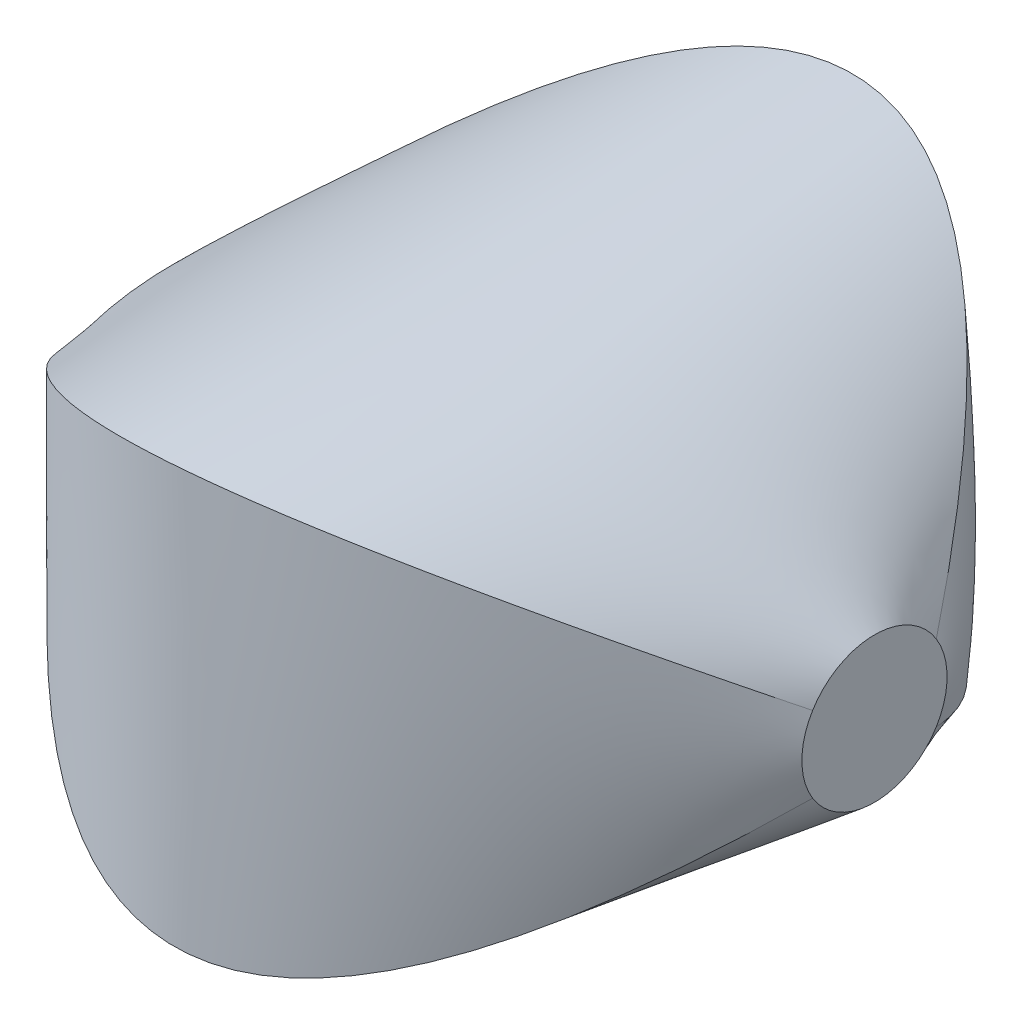
ISO-10303-21;
HEADER;
FILE_DESCRIPTION(('STEP AP214'),'2;1');
FILE_NAME('part.step','',(''),(''),'','','');
FILE_SCHEMA(('AUTOMOTIVE_DESIGN { 1 0 10303 214 1 1 1 1 }'));
ENDSEC;
DATA;
#1=APPLICATION_CONTEXT('core data for automotive mechanical design processes');
#2=APPLICATION_PROTOCOL_DEFINITION('international standard','automotive_design',2000,#1);
#3=PRODUCT_CONTEXT('',#1,'mechanical');
#4=PRODUCT('Part','Part','',(#3));
#5=PRODUCT_RELATED_PRODUCT_CATEGORY('part','',(#4));
#6=PRODUCT_DEFINITION_FORMATION('','',#4);
#7=PRODUCT_DEFINITION_CONTEXT('part definition',#1,'design');
#8=PRODUCT_DEFINITION('design','',#6,#7);
#9=PRODUCT_DEFINITION_SHAPE('','',#8);
#10=(LENGTH_UNIT() NAMED_UNIT(*) SI_UNIT(.MILLI.,.METRE.));
#11=(NAMED_UNIT(*) PLANE_ANGLE_UNIT() SI_UNIT($,.RADIAN.));
#12=(NAMED_UNIT(*) SI_UNIT($,.STERADIAN.) SOLID_ANGLE_UNIT());
#13=UNCERTAINTY_MEASURE_WITH_UNIT(LENGTH_MEASURE(1.E-05),#10,'distance_accuracy_value','');
#14=(GEOMETRIC_REPRESENTATION_CONTEXT(3) GLOBAL_UNCERTAINTY_ASSIGNED_CONTEXT((#13)) GLOBAL_UNIT_ASSIGNED_CONTEXT((#10,
#11,#12)) REPRESENTATION_CONTEXT('',''));
#15=CARTESIAN_POINT('',(0.,0.,0.));
#16=DIRECTION('',(0.,0.,1.));
#17=DIRECTION('',(1.,0.,0.));
#18=AXIS2_PLACEMENT_3D('',#15,#16,#17);
#19=CARTESIAN_POINT('',(50.,0.,0.));
#20=DIRECTION('',(1.,0.,0.));
#21=DIRECTION('',(0.,0.,-1.));
#22=AXIS2_PLACEMENT_3D('',#19,#20,#21);
#23=PLANE('',#22);
#24=CARTESIAN_POINT('',(50.,0.,0.));
#25=DIRECTION('',(1.,0.,0.));
#26=DIRECTION('',(0.,0.,-1.));
#27=AXIS2_PLACEMENT_3D('',#24,#25,#26);
#28=CIRCLE('',#27,10.);
#29=CARTESIAN_POINT('',(50.,5.23707774198885,-8.51897979363521));
#30=VERTEX_POINT('',#29);
#31=CARTESIAN_POINT('',(50.,5.23707774198886,8.5189797936352));
#32=VERTEX_POINT('',#31);
#33=EDGE_CURVE('E12',#30,#32,#28,.T.);
#34=ORIENTED_EDGE('',*,*,#33,.T.);
#35=CARTESIAN_POINT('',(50.,-5.23707774198886,8.5189797936352));
#36=VERTEX_POINT('',#35);
#37=EDGE_CURVE('E136',#32,#36,#28,.T.);
#38=ORIENTED_EDGE('',*,*,#37,.T.);
#39=CARTESIAN_POINT('',(50.,-5.23707774198886,-8.5189797936352));
#40=VERTEX_POINT('',#39);
#41=EDGE_CURVE('E280',#36,#40,#28,.T.);
#42=ORIENTED_EDGE('',*,*,#41,.T.);
#43=EDGE_CURVE('E201',#40,#30,#28,.T.);
#44=ORIENTED_EDGE('',*,*,#43,.T.);
#45=EDGE_LOOP('',(#34,#38,#42,#44));
#46=FACE_BOUND('',#45,.T.);
#47=ADVANCED_FACE('F125',(#46),#23,.T.);
#48=CARTESIAN_POINT('',(-50.,0.,0.));
#49=DIRECTION('',(1.,0.,0.));
#50=DIRECTION('',(0.,0.,-1.));
#51=AXIS2_PLACEMENT_3D('',#48,#49,#50);
#52=PLANE('',#51);
#53=CARTESIAN_POINT('',(-50.,0.,0.));
#54=DIRECTION('',(1.,0.,0.));
#55=DIRECTION('',(0.,0.0792949814580493,-0.996851195472809));
#56=AXIS2_PLACEMENT_3D('',#53,#54,#55);
#57=ELLIPSE('',#56,10.0315875081606,2.36185766200092);
#58=CARTESIAN_POINT('',(-50.,0.385148291112215,-9.88721745718651));
#59=VERTEX_POINT('',#58);
#60=CARTESIAN_POINT('',(-50.,1.07060677175906,-9.90626987124121));
#61=VERTEX_POINT('',#60);
#62=EDGE_CURVE('E169',#59,#61,#57,.T.);
#63=ORIENTED_EDGE('',*,*,#62,.F.);
#64=CARTESIAN_POINT('',(-50.,-1.07060677175906,9.90626987124122));
#65=VERTEX_POINT('',#64);
#66=EDGE_CURVE('E174',#65,#59,#57,.T.);
#67=ORIENTED_EDGE('',*,*,#66,.F.);
#68=CARTESIAN_POINT('',(-50.,-0.385148291112216,9.88721745718651));
#69=VERTEX_POINT('',#68);
#70=EDGE_CURVE('E195',#69,#65,#57,.T.);
#71=ORIENTED_EDGE('',*,*,#70,.F.);
#72=EDGE_CURVE('E176',#61,#69,#57,.T.);
#73=ORIENTED_EDGE('',*,*,#72,.F.);
#74=EDGE_LOOP('',(#63,#67,#71,#73));
#75=FACE_BOUND('',#74,.T.);
#76=ADVANCED_FACE('F172',(#75),#52,.F.);
#77=CARTESIAN_POINT('',(-50.,-0.385148291112216,9.88721745718651));
#78=CARTESIAN_POINT('',(-33.6537867469248,18.0545955535037,34.6593630308246));
#79=CARTESIAN_POINT('',(-0.387090231439185,37.4476209110736,59.2028119403248));
#80=CARTESIAN_POINT('',(33.0128799197419,21.8027462422378,33.747204588457));
#81=CARTESIAN_POINT('',(50.,5.23707774198886,8.5189797936352));
#82=CARTESIAN_POINT('',(-50.,-0.622701145356153,10.0332540479102));
#83=CARTESIAN_POINT('',(-33.6073694324775,5.76301701046526,34.8016006277786));
#84=CARTESIAN_POINT('',(-0.433518003647173,12.4250531851073,58.1256835477101));
#85=CARTESIAN_POINT('',(33.0592972341892,7.62471632565103,35.7198896780428));
#86=CARTESIAN_POINT('',(50.,2.02544051382655,10.4933469420956));
#87=CARTESIAN_POINT('',(-50.,-0.853605851347531,10.0396720764122));
#88=CARTESIAN_POINT('',(-33.5609521180302,-6.52191338432063,34.804219662511));
#89=CARTESIAN_POINT('',(-0.479945775855162,-12.1721444257278,58.1252606070612));
#90=CARTESIAN_POINT('',(33.1057145486365,-7.39255739042648,35.7182076191681));
#91=CARTESIAN_POINT('',(50.,-2.02544051382655,10.4933469420956));
#92=CARTESIAN_POINT('',(-50.,-1.07060677175906,9.90626987124122));
#93=CARTESIAN_POINT('',(-33.5145348035829,-18.7929399935267,34.6670184635703));
#94=CARTESIAN_POINT('',(-0.52637354806315,-37.2047722906626,59.2016418362333));
#95=CARTESIAN_POINT('',(33.1521318630838,-21.5705873070132,33.7421584118329));
#96=CARTESIAN_POINT('',(50.,-5.23707774198886,8.5189797936352));
#97=B_SPLINE_SURFACE_WITH_KNOTS('',3,3,((#77,#78,#79,#80,#81),(#82,#83,#84,#85,#86),(#87,#88,
#89,#90,#91),(#92,#93,#94,#95,#96)),.UNSPECIFIED.,.F.,.F.,.F.,(4,4),(4,1,4),(0.,1.),(0.,
0.505306521044614,1.),.UNSPECIFIED.);
#98=CARTESIAN_POINT('',(-50.,-1.07060677175906,9.90626987124122));
#99=CARTESIAN_POINT('',(-33.5145348035829,-18.7929399935267,34.6670184635703));
#100=CARTESIAN_POINT('',(-0.52637354806315,-37.2047722906626,59.2016418362333));
#101=CARTESIAN_POINT('',(33.1521318630838,-21.5705873070132,33.7421584118329));
#102=CARTESIAN_POINT('',(50.,-5.23707774198886,8.5189797936352));
#103=B_SPLINE_CURVE_WITH_KNOTS('',3,(#98,#99,#100,#101,#102),.UNSPECIFIED.,.F.,.F.,(4,1,4),(0.,
0.505306521044614,1.),.UNSPECIFIED.);
#104=EDGE_CURVE('E193',#65,#36,#103,.T.);
#105=CARTESIAN_POINT('',(-50.,-0.385148291112216,9.88721745718651));
#106=CARTESIAN_POINT('',(-33.6537867469248,18.0545955535037,34.6593630308246));
#107=CARTESIAN_POINT('',(-0.387090231439185,37.4476209110736,59.2028119403248));
#108=CARTESIAN_POINT('',(33.0128799197419,21.8027462422378,33.747204588457));
#109=CARTESIAN_POINT('',(50.,5.23707774198886,8.5189797936352));
#110=B_SPLINE_CURVE_WITH_KNOTS('',3,(#105,#106,#107,#108,#109),.UNSPECIFIED.,.F.,.F.,(4,1,4),
(0.,0.505306521044614,1.),.UNSPECIFIED.);
#111=EDGE_CURVE('E182',#32,#69,#110,.F.);
#112=CARTESIAN_POINT('',(-50.,-0.385148291112216,9.88721745718651));
#113=CARTESIAN_POINT('',(-33.6537867469248,18.0545955535037,34.6593630308246));
#114=CARTESIAN_POINT('',(-0.387090231439185,37.4476209110736,59.2028119403248));
#115=CARTESIAN_POINT('',(33.0128799197419,21.8027462422378,33.747204588457));
#116=CARTESIAN_POINT('',(50.,5.23707774198886,8.5189797936352));
#117=CARTESIAN_POINT('',(50.000034338678,5.23704425525575,8.51892879594498));
#118=CARTESIAN_POINT('',(50.000068677356,5.23701076852264,8.51887779825476));
#119=CARTESIAN_POINT('',(50.000103016034,5.23697728178953,8.51882680056454));
#120=CARTESIAN_POINT('',(-50.,-0.622701145356153,10.0332540479102));
#121=CARTESIAN_POINT('',(-33.6073694324775,5.76301701046526,34.8016006277786));
#122=CARTESIAN_POINT('',(-0.433518003647173,12.4250531851073,58.1256835477101));
#123=CARTESIAN_POINT('',(33.0592972341892,7.62471632565103,35.7198896780428));
#124=CARTESIAN_POINT('',(50.,2.02544051382655,10.4933469420956));
#125=CARTESIAN_POINT('',(50.0000342448475,2.02542919514933,10.4932959478056));
#126=CARTESIAN_POINT('',(50.0000684896951,2.02541787647211,10.4932449535156));
#127=CARTESIAN_POINT('',(50.0001027345426,2.02540655779488,10.4931939592256));
#128=CARTESIAN_POINT('',(-50.,-0.853605851347531,10.0396720764122));
#129=CARTESIAN_POINT('',(-33.5609521180302,-6.52191338432063,34.804219662511));
#130=CARTESIAN_POINT('',(-0.479945775855162,-12.1721444257278,58.1252606070612));
#131=CARTESIAN_POINT('',(33.1057145486365,-7.39255739042648,35.7182076191681));
#132=CARTESIAN_POINT('',(50.,-2.02544051382655,10.4933469420956));
#133=CARTESIAN_POINT('',(50.0000341510171,-2.02542966444788,10.4932959512058));
#134=CARTESIAN_POINT('',(50.0000683020342,-2.02541881506922,10.493244960316));
#135=CARTESIAN_POINT('',(50.0001024530513,-2.02540796569055,10.4931939694262));
#136=CARTESIAN_POINT('',(-50.,-1.07060677175906,9.90626987124122));
#137=CARTESIAN_POINT('',(-33.5145348035829,-18.7929399935267,34.6670184635703));
#138=CARTESIAN_POINT('',(-0.52637354806315,-37.2047722906626,59.2016418362333));
#139=CARTESIAN_POINT('',(33.1521318630838,-21.5705873070132,33.7421584118329));
#140=CARTESIAN_POINT('',(50.,-5.23707774198886,8.5189797936352));
#141=CARTESIAN_POINT('',(50.0000340571866,-5.2370447245543,8.5189288061456));
#142=CARTESIAN_POINT('',(50.0000681143733,-5.23701170711975,8.51887781865598));
#143=CARTESIAN_POINT('',(50.0001021715599,-5.2369786896852,8.51882683116638));
#144=B_SPLINE_SURFACE_WITH_KNOTS('',3,3,((#112,#113,#114,#115,#116,#117,#118,#119),(#120,#121,
#122,#123,#124,#125,#126,#127),(#128,#129,#130,#131,#132,#133,#134,#135),(#136,#137,#138,#139,
#140,#141,#142,#143)),.UNSPECIFIED.,.F.,.F.,.F.,(4,4),(4,1,3,4),(0.,1.),(0.,0.505306521044614,
1.,1.000001),.UNSPECIFIED.);
#145=ORIENTED_EDGE('',*,*,#70,.T.);
#146=ORIENTED_EDGE('',*,*,#104,.T.);
#147=ORIENTED_EDGE('',*,*,#37,.F.);
#148=ORIENTED_EDGE('',*,*,#111,.T.);
#149=EDGE_LOOP('',(#145,#146,#147,#148));
#150=FACE_BOUND('',#149,.T.);
#151=ADVANCED_FACE('F293',(#150),#144,.T.);
#152=CARTESIAN_POINT('',(-50.,-1.07060677175906,9.90626987124122));
#153=CARTESIAN_POINT('',(-33.5145348035829,-18.7929399935267,34.6670184635703));
#154=CARTESIAN_POINT('',(-0.526373548063146,-37.2047722906626,59.2016418362333));
#155=CARTESIAN_POINT('',(33.1521318630838,-21.5705873070132,33.7421584118329));
#156=CARTESIAN_POINT('',(50.,-5.23707774198886,8.5189797936352));
#157=CARTESIAN_POINT('',(-50.,-1.34886627650671,9.73520870028979));
#158=CARTESIAN_POINT('',(-33.5395617236974,-18.8237368500363,32.1348987247623));
#159=CARTESIAN_POINT('',(-0.501340989416021,-37.0131225008222,54.0600631410415));
#160=CARTESIAN_POINT('',(33.1271049429693,-21.9163195995369,30.9958190211114));
#161=CARTESIAN_POINT('',(50.,-5.97690766699647,8.06416631514692));
#162=CARTESIAN_POINT('',(-50.,-1.83597939802293,8.95892922429729));
#163=CARTESIAN_POINT('',(-33.5896155639264,-18.8159246750765,26.6365021130566));
#164=CARTESIAN_POINT('',(-0.45127587212177,-36.7375789703456,44.0782039054848));
#165=CARTESIAN_POINT('',(33.0770511027403,-22.4633195418281,25.3293116641242));
#166=CARTESIAN_POINT('',(50.0000000000001,-7.31210287425547,6.98071078262633));
#167=CARTESIAN_POINT('',(-50.0000000000001,-2.32207109054673,6.71628382131466));
#168=CARTESIAN_POINT('',(-33.735073138054,-18.8053647734551,18.1185781080963));
#169=CARTESIAN_POINT('',(-0.305785526591588,-36.397796524208,29.1898644008506));
#170=CARTESIAN_POINT('',(32.9315935286127,-23.1387323896625,16.9232921398906));
#171=CARTESIAN_POINT('',(50.,-8.82076249913179,4.92800380245923));
#172=CARTESIAN_POINT('',(-49.9999999999999,-2.53403566663348,3.71226737888908));
#173=CARTESIAN_POINT('',(-33.8512363849517,-18.7380487393597,9.21266208092382));
#174=CARTESIAN_POINT('',(-0.189596108265163,-36.2131508420589,14.5209516848234));
#175=CARTESIAN_POINT('',(32.815430281715,-23.5647854905728,8.45950140617163));
#176=CARTESIAN_POINT('',(50.,-9.77454968025243,2.58136340122052));
#177=CARTESIAN_POINT('',(-50.,-2.42789647170414,0.0675680554316146));
#178=CARTESIAN_POINT('',(-33.9156461210027,-18.6220125841813,0.0342800910010694));
#179=CARTESIAN_POINT('',(-0.125171860784285,-36.1776978057717,-0.0112809353406747));
#180=CARTESIAN_POINT('',(32.751020545664,-23.745415397275,-0.0107672317586047));
#181=CARTESIAN_POINT('',(50.,-10.1127251598738,0.));
#182=CARTESIAN_POINT('',(-50.0000000000001,-1.99722943993457,-3.58653412761509));
#183=CARTESIAN_POINT('',(-33.9012184625638,-18.4630846091523,-9.14952575131821));
#184=CARTESIAN_POINT('',(-0.139602769755937,-36.3054994901793,-14.5412959930053));
#185=CARTESIAN_POINT('',(32.765448204103,-23.6475026099747,-8.48017943419427));
#186=CARTESIAN_POINT('',(50.,-9.77454968025241,-2.58136340122053));
#187=CARTESIAN_POINT('',(-49.9999999999999,-1.34166467021577,-6.61402328354616));
#188=CARTESIAN_POINT('',(-33.8272821823393,-18.3029470884248,-18.0684941191971));
#189=CARTESIAN_POINT('',(-0.213555707728246,-36.5661268536422,-29.2051275756776));
#190=CARTESIAN_POINT('',(32.8393844843272,-23.290677257613,-16.9414091774442));
#191=CARTESIAN_POINT('',(49.9999999999999,-8.82076249913181,-4.92800380245921));
#192=CARTESIAN_POINT('',(-50.,-0.522980260919271,-8.89354640524878));
#193=CARTESIAN_POINT('',(-33.7159183684582,-18.1515254545434,-26.6062918578362));
#194=CARTESIAN_POINT('',(-0.324944611732168,-36.9565241681228,-44.0862109779684));
#195=CARTESIAN_POINT('',(32.9507482982086,-22.6714095565139,-25.3425884263954));
#196=CARTESIAN_POINT('',(50.,-7.31210287425547,-6.98071078262634));
#197=CARTESIAN_POINT('',(-50.,0.0805351150577006,-9.69995525879234));
#198=CARTESIAN_POINT('',(-33.6744972874358,-18.0888091792276,-32.1189674587468));
#199=CARTESIAN_POINT('',(-0.366375024870191,-37.2583961664162,-54.0638830585789));
#200=CARTESIAN_POINT('',(32.9921693792308,-22.1404555612485,-31.0036087262845));
#201=CARTESIAN_POINT('',(50.,-5.97690766699647,-8.06416631514691));
#202=CARTESIAN_POINT('',(-50.,0.385148291112215,-9.88721745718651));
#203=CARTESIAN_POINT('',(-33.6537867469248,-18.0545955535037,-34.6593630308246));
#204=CARTESIAN_POINT('',(-0.387090231439181,-37.4476209110736,-59.2028119403248));
#205=CARTESIAN_POINT('',(33.0128799197419,-21.8027462422378,-33.747204588457));
#206=CARTESIAN_POINT('',(50.,-5.23707774198886,-8.5189797936352));
#207=B_SPLINE_SURFACE_WITH_KNOTS('',3,3,((#152,#153,#154,#155,#156),(#157,#158,#159,#160,#161),
(#162,#163,#164,#165,#166),(#167,#168,#169,#170,#171),(#172,#173,#174,#175,#176),(#177,#178,
#179,#180,#181),(#182,#183,#184,#185,#186),(#187,#188,#189,#190,#191),(#192,#193,#194,#195,
#196),(#197,#198,#199,#200,#201),(#202,#203,#204,#205,#206)),.UNSPECIFIED.,.F.,.F.,.F.,(4,1,1,1,
1,1,1,1,4),(4,1,4),(0.,0.125,0.25,0.375,0.5,0.625,0.75,0.875,1.),(0.,0.505306521044614,1.),.UNSPECIFIED.);
#208=CARTESIAN_POINT('',(-50.,0.385148291112215,-9.88721745718651));
#209=CARTESIAN_POINT('',(-33.6537867469248,-18.0545955535037,-34.6593630308246));
#210=CARTESIAN_POINT('',(-0.387090231439181,-37.4476209110736,-59.2028119403248));
#211=CARTESIAN_POINT('',(33.0128799197419,-21.8027462422378,-33.747204588457));
#212=CARTESIAN_POINT('',(50.,-5.23707774198886,-8.5189797936352));
#213=B_SPLINE_CURVE_WITH_KNOTS('',3,(#208,#209,#210,#211,#212),.UNSPECIFIED.,.F.,.F.,(4,1,4),
(0.,0.505306521044614,1.),.UNSPECIFIED.);
#214=EDGE_CURVE('E191',#59,#40,#213,.T.);
#215=ORIENTED_EDGE('',*,*,#66,.T.);
#216=ORIENTED_EDGE('',*,*,#214,.T.);
#217=ORIENTED_EDGE('',*,*,#41,.F.);
#218=ORIENTED_EDGE('',*,*,#104,.F.);
#219=EDGE_LOOP('',(#215,#216,#217,#218));
#220=FACE_BOUND('',#219,.T.);
#221=ADVANCED_FACE('F190',(#220),#207,.T.);
#222=CARTESIAN_POINT('',(-50.,1.07060677175906,-9.90626987124121));
#223=CARTESIAN_POINT('',(-33.5145348035829,18.7929399935267,-34.6670184635703));
#224=CARTESIAN_POINT('',(-0.526373548063146,37.2047722906626,-59.2016418362333));
#225=CARTESIAN_POINT('',(33.1521318630838,21.5705873070132,-33.7421584118329));
#226=CARTESIAN_POINT('',(50.,5.23707774198886,-8.5189797936352));
#227=CARTESIAN_POINT('',(-50.,1.34886627650671,-9.73520870028979));
#228=CARTESIAN_POINT('',(-33.5395617236974,18.8237368500363,-32.1348987247623));
#229=CARTESIAN_POINT('',(-0.501340989416011,37.0131225008222,-54.0600631410415));
#230=CARTESIAN_POINT('',(33.1271049429693,21.9163195995369,-30.9958190211114));
#231=CARTESIAN_POINT('',(50.,5.97690766699647,-8.06416631514692));
#232=CARTESIAN_POINT('',(-50.,1.83597939802293,-8.95892922429729));
#233=CARTESIAN_POINT('',(-33.5896155639265,18.8159246750765,-26.6365021130566));
#234=CARTESIAN_POINT('',(-0.451275872121736,36.7375789703456,-44.0782039054848));
#235=CARTESIAN_POINT('',(33.0770511027403,22.4633195418281,-25.3293116641242));
#236=CARTESIAN_POINT('',(50.0000000000001,7.31210287425547,-6.98071078262633));
#237=CARTESIAN_POINT('',(-50.0000000000001,2.32207109054673,-6.71628382131465));
#238=CARTESIAN_POINT('',(-33.7350731380539,18.8053647734551,-18.1185781080963));
#239=CARTESIAN_POINT('',(-0.305785526591616,36.397796524208,-29.1898644008506));
#240=CARTESIAN_POINT('',(32.9315935286127,23.1387323896625,-16.9232921398906));
#241=CARTESIAN_POINT('',(50.,8.82076249913179,-4.92800380245923));
#242=CARTESIAN_POINT('',(-49.9999999999999,2.53403566663348,-3.71226737888908));
#243=CARTESIAN_POINT('',(-33.8512363849517,18.7380487393597,-9.21266208092382));
#244=CARTESIAN_POINT('',(-0.189596108265177,36.2131508420589,-14.5209516848234));
#245=CARTESIAN_POINT('',(32.815430281715,23.5647854905728,-8.45950140617163));
#246=CARTESIAN_POINT('',(50.,9.77454968025243,-2.58136340122052));
#247=CARTESIAN_POINT('',(-50.,2.42789647170414,-0.0675680554316029));
#248=CARTESIAN_POINT('',(-33.9156461210027,18.6220125841813,-0.0342800910010623));
#249=CARTESIAN_POINT('',(-0.125171860784272,36.1776978057717,0.0112809353406723));
#250=CARTESIAN_POINT('',(32.751020545664,23.745415397275,0.0107672317586025));
#251=CARTESIAN_POINT('',(50.,10.1127251598738,0.));
#252=CARTESIAN_POINT('',(-50.0000000000001,1.99722943993457,3.58653412761509));
#253=CARTESIAN_POINT('',(-33.9012184625637,18.4630846091523,9.14952575131821));
#254=CARTESIAN_POINT('',(-0.139602769755944,36.3054994901793,14.5412959930053));
#255=CARTESIAN_POINT('',(32.765448204103,23.6475026099747,8.48017943419427));
#256=CARTESIAN_POINT('',(50.,9.77454968025241,2.58136340122053));
#257=CARTESIAN_POINT('',(-49.9999999999999,1.34166467021577,6.61402328354617));
#258=CARTESIAN_POINT('',(-33.8272821823393,18.3029470884248,18.0684941191971));
#259=CARTESIAN_POINT('',(-0.213555707728246,36.5661268536422,29.2051275756775));
#260=CARTESIAN_POINT('',(32.8393844843272,23.290677257613,16.9414091774442));
#261=CARTESIAN_POINT('',(49.9999999999999,8.82076249913181,4.92800380245921));
#262=CARTESIAN_POINT('',(-50.,0.522980260919271,8.89354640524877));
#263=CARTESIAN_POINT('',(-33.7159183684582,18.1515254545434,26.6062918578362));
#264=CARTESIAN_POINT('',(-0.324944611732168,36.9565241681228,44.0862109779684));
#265=CARTESIAN_POINT('',(32.9507482982086,22.6714095565139,25.3425884263954));
#266=CARTESIAN_POINT('',(50.,7.31210287425547,6.98071078262634));
#267=CARTESIAN_POINT('',(-50.,-0.0805351150577017,9.69995525879234));
#268=CARTESIAN_POINT('',(-33.6744972874358,18.0888091792276,32.1189674587468));
#269=CARTESIAN_POINT('',(-0.366375024870191,37.2583961664162,54.0638830585789));
#270=CARTESIAN_POINT('',(32.9921693792308,22.1404555612485,31.0036087262845));
#271=CARTESIAN_POINT('',(50.,5.97690766699647,8.06416631514691));
#272=CARTESIAN_POINT('',(-50.,-0.385148291112216,9.88721745718651));
#273=CARTESIAN_POINT('',(-33.6537867469248,18.0545955535037,34.6593630308246));
#274=CARTESIAN_POINT('',(-0.387090231439181,37.4476209110736,59.2028119403248));
#275=CARTESIAN_POINT('',(33.0128799197419,21.8027462422378,33.747204588457));
#276=CARTESIAN_POINT('',(50.,5.23707774198886,8.5189797936352));
#277=B_SPLINE_SURFACE_WITH_KNOTS('',3,3,((#222,#223,#224,#225,#226),(#227,#228,#229,#230,#231),
(#232,#233,#234,#235,#236),(#237,#238,#239,#240,#241),(#242,#243,#244,#245,#246),(#247,#248,
#249,#250,#251),(#252,#253,#254,#255,#256),(#257,#258,#259,#260,#261),(#262,#263,#264,#265,
#266),(#267,#268,#269,#270,#271),(#272,#273,#274,#275,#276)),.UNSPECIFIED.,.F.,.F.,.F.,(4,1,1,1,
1,1,1,1,4),(4,1,4),(0.,0.125,0.25,0.375,0.5,0.625,0.75,0.875,1.),(0.,0.505306521044614,1.),.UNSPECIFIED.);
#278=CARTESIAN_POINT('',(-50.,1.07060677175906,-9.90626987124122));
#279=CARTESIAN_POINT('',(-33.5145348035829,18.7929399935267,-34.6670184635703));
#280=CARTESIAN_POINT('',(-0.52637354806315,37.2047722906626,-59.2016418362333));
#281=CARTESIAN_POINT('',(33.1521318630838,21.5705873070132,-33.7421584118329));
#282=CARTESIAN_POINT('',(50.,5.23707774198885,-8.5189797936352));
#283=B_SPLINE_CURVE_WITH_KNOTS('',3,(#278,#279,#280,#281,#282),.UNSPECIFIED.,.F.,.F.,(4,1,4),
(0.,0.505306521044614,1.),.UNSPECIFIED.);
#284=EDGE_CURVE('E204',#61,#30,#283,.T.);
#285=ORIENTED_EDGE('',*,*,#72,.T.);
#286=ORIENTED_EDGE('',*,*,#111,.F.);
#287=ORIENTED_EDGE('',*,*,#33,.F.);
#288=ORIENTED_EDGE('',*,*,#284,.F.);
#289=EDGE_LOOP('',(#285,#286,#287,#288));
#290=FACE_BOUND('',#289,.T.);
#291=ADVANCED_FACE('F242',(#290),#277,.T.);
#292=CARTESIAN_POINT('',(-50.,0.385148291112214,-9.88721745718651));
#293=CARTESIAN_POINT('',(-33.6537867469248,-18.0545955535037,-34.6593630308246));
#294=CARTESIAN_POINT('',(-0.387090231439185,-37.4476209110736,-59.2028119403248));
#295=CARTESIAN_POINT('',(33.0128799197419,-21.8027462422378,-33.747204588457));
#296=CARTESIAN_POINT('',(50.,-5.23707774198886,-8.5189797936352));
#297=CARTESIAN_POINT('',(-50.,0.622701145356152,-10.0332540479102));
#298=CARTESIAN_POINT('',(-33.6073694324775,-5.76301701046526,-34.8016006277786));
#299=CARTESIAN_POINT('',(-0.433518003647173,-12.4250531851073,-58.1256835477101));
#300=CARTESIAN_POINT('',(33.0592972341892,-7.62471632565104,-35.7198896780428));
#301=CARTESIAN_POINT('',(50.,-2.02544051382655,-10.4933469420956));
#302=CARTESIAN_POINT('',(-50.,0.853605851347531,-10.0396720764122));
#303=CARTESIAN_POINT('',(-33.5609521180302,6.52191338432063,-34.804219662511));
#304=CARTESIAN_POINT('',(-0.479945775855162,12.1721444257278,-58.1252606070612));
#305=CARTESIAN_POINT('',(33.1057145486365,7.39255739042648,-35.7182076191681));
#306=CARTESIAN_POINT('',(50.,2.02544051382654,-10.4933469420956));
#307=CARTESIAN_POINT('',(-50.,1.07060677175906,-9.90626987124122));
#308=CARTESIAN_POINT('',(-33.5145348035829,18.7929399935267,-34.6670184635703));
#309=CARTESIAN_POINT('',(-0.52637354806315,37.2047722906626,-59.2016418362333));
#310=CARTESIAN_POINT('',(33.1521318630838,21.5705873070132,-33.7421584118329));
#311=CARTESIAN_POINT('',(50.,5.23707774198885,-8.5189797936352));
#312=B_SPLINE_SURFACE_WITH_KNOTS('',3,3,((#292,#293,#294,#295,#296),(#297,#298,#299,#300,#301),
(#302,#303,#304,#305,#306),(#307,#308,#309,#310,#311)),.UNSPECIFIED.,.F.,.F.,.F.,(4,4),(4,1,4),
(0.,1.),(0.,0.505306521044614,1.),.UNSPECIFIED.);
#313=CARTESIAN_POINT('',(-50.,0.385148291112214,-9.88721745718651));
#314=CARTESIAN_POINT('',(-33.6537867469248,-18.0545955535037,-34.6593630308246));
#315=CARTESIAN_POINT('',(-0.387090231439185,-37.4476209110736,-59.2028119403248));
#316=CARTESIAN_POINT('',(33.0128799197419,-21.8027462422378,-33.747204588457));
#317=CARTESIAN_POINT('',(50.,-5.23707774198886,-8.5189797936352));
#318=CARTESIAN_POINT('',(50.000034338678,-5.23704425525575,-8.51892879594498));
#319=CARTESIAN_POINT('',(50.000068677356,-5.23701076852264,-8.51887779825476));
#320=CARTESIAN_POINT('',(50.000103016034,-5.23697728178953,-8.51882680056453));
#321=CARTESIAN_POINT('',(-50.,0.622701145356152,-10.0332540479102));
#322=CARTESIAN_POINT('',(-33.6073694324775,-5.76301701046526,-34.8016006277786));
#323=CARTESIAN_POINT('',(-0.433518003647173,-12.4250531851073,-58.1256835477101));
#324=CARTESIAN_POINT('',(33.0592972341892,-7.62471632565104,-35.7198896780428));
#325=CARTESIAN_POINT('',(50.,-2.02544051382655,-10.4933469420956));
#326=CARTESIAN_POINT('',(50.0000342448475,-2.02542919514933,-10.4932959478056));
#327=CARTESIAN_POINT('',(50.0000684896951,-2.02541787647211,-10.4932449535156));
#328=CARTESIAN_POINT('',(50.0001027345426,-2.02540655779489,-10.4931939592256));
#329=CARTESIAN_POINT('',(-50.,0.853605851347531,-10.0396720764122));
#330=CARTESIAN_POINT('',(-33.5609521180302,6.52191338432063,-34.804219662511));
#331=CARTESIAN_POINT('',(-0.479945775855162,12.1721444257278,-58.1252606070612));
#332=CARTESIAN_POINT('',(33.1057145486365,7.39255739042648,-35.7182076191681));
#333=CARTESIAN_POINT('',(50.,2.02544051382654,-10.4933469420956));
#334=CARTESIAN_POINT('',(50.0000341510171,2.02542966444788,-10.4932959512058));
#335=CARTESIAN_POINT('',(50.0000683020342,2.02541881506921,-10.493244960316));
#336=CARTESIAN_POINT('',(50.0001024530513,2.02540796569055,-10.4931939694262));
#337=CARTESIAN_POINT('',(-50.,1.07060677175906,-9.90626987124122));
#338=CARTESIAN_POINT('',(-33.5145348035829,18.7929399935267,-34.6670184635703));
#339=CARTESIAN_POINT('',(-0.52637354806315,37.2047722906626,-59.2016418362333));
#340=CARTESIAN_POINT('',(33.1521318630838,21.5705873070132,-33.7421584118329));
#341=CARTESIAN_POINT('',(50.,5.23707774198885,-8.5189797936352));
#342=CARTESIAN_POINT('',(50.0000340571866,5.2370447245543,-8.5189288061456));
#343=CARTESIAN_POINT('',(50.0000681143733,5.23701170711975,-8.51887781865598));
#344=CARTESIAN_POINT('',(50.0001021715599,5.2369786896852,-8.51882683116638));
#345=B_SPLINE_SURFACE_WITH_KNOTS('',3,3,((#313,#314,#315,#316,#317,#318,#319,#320),(#321,#322,
#323,#324,#325,#326,#327,#328),(#329,#330,#331,#332,#333,#334,#335,#336),(#337,#338,#339,#340,
#341,#342,#343,#344)),.UNSPECIFIED.,.F.,.F.,.F.,(4,4),(4,1,3,4),(0.,1.),(0.,0.505306521044614,
1.,1.000001),.UNSPECIFIED.);
#346=ORIENTED_EDGE('',*,*,#62,.T.);
#347=ORIENTED_EDGE('',*,*,#284,.T.);
#348=ORIENTED_EDGE('',*,*,#43,.F.);
#349=ORIENTED_EDGE('',*,*,#214,.F.);
#350=EDGE_LOOP('',(#346,#347,#348,#349));
#351=FACE_BOUND('',#350,.T.);
#352=ADVANCED_FACE('F200',(#351),#345,.T.);
#353=CLOSED_SHELL('',(#47,#76,#151,#221,#291,#352));
#354=MANIFOLD_SOLID_BREP('B2',#353);
#355=ADVANCED_BREP_SHAPE_REPRESENTATION('',(#18,#354),#14);
#356=SHAPE_DEFINITION_REPRESENTATION(#9,#355);
ENDSEC;
END-ISO-10303-21;
